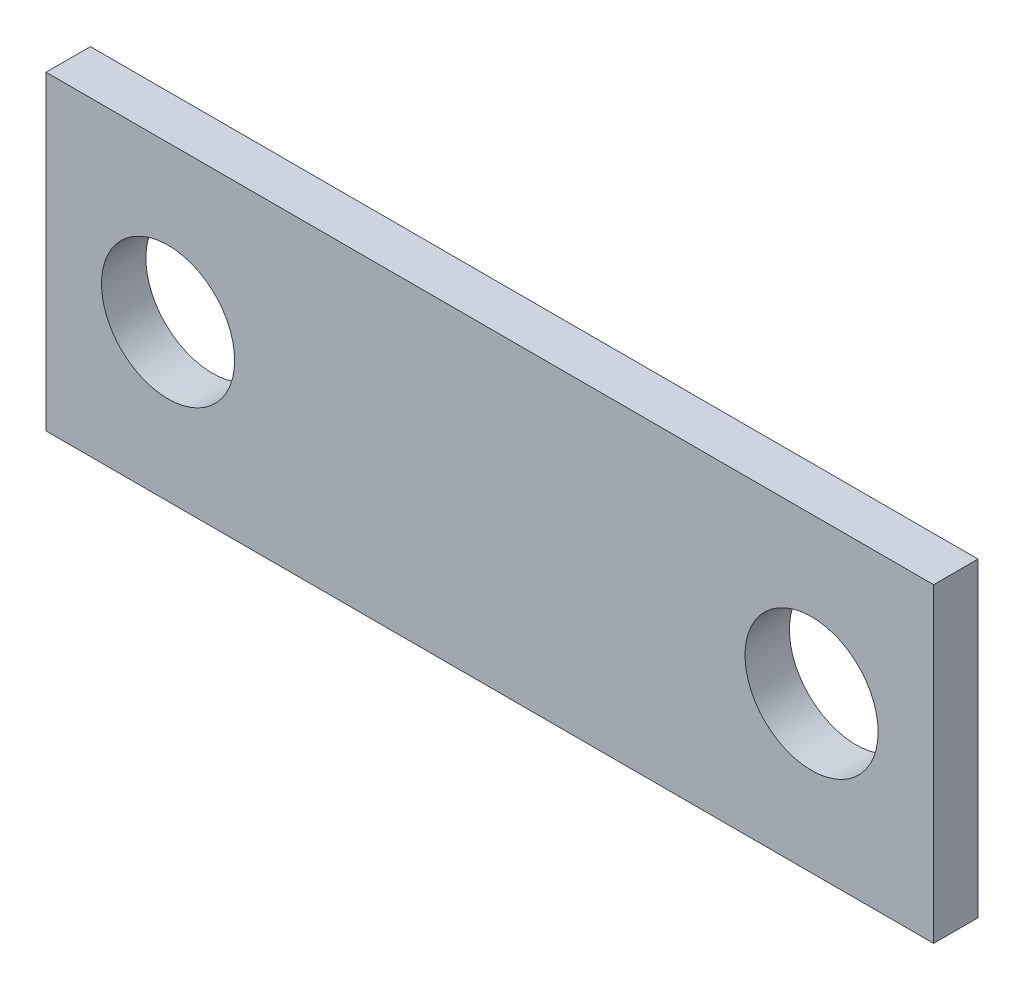
ISO-10303-21;
HEADER;
FILE_DESCRIPTION(('STEP AP214'),'2;1');
FILE_NAME('part.step','',(''),(''),'','','');
FILE_SCHEMA(('AUTOMOTIVE_DESIGN { 1 0 10303 214 1 1 1 1 }'));
ENDSEC;
DATA;
#1=APPLICATION_CONTEXT('core data for automotive mechanical design processes');
#2=APPLICATION_PROTOCOL_DEFINITION('international standard','automotive_design',2000,#1);
#3=PRODUCT_CONTEXT('',#1,'mechanical');
#4=PRODUCT('Part','Part','',(#3));
#5=PRODUCT_RELATED_PRODUCT_CATEGORY('part','',(#4));
#6=PRODUCT_DEFINITION_FORMATION('','',#4);
#7=PRODUCT_DEFINITION_CONTEXT('part definition',#1,'design');
#8=PRODUCT_DEFINITION('design','',#6,#7);
#9=PRODUCT_DEFINITION_SHAPE('','',#8);
#10=(LENGTH_UNIT() NAMED_UNIT(*) SI_UNIT(.MILLI.,.METRE.));
#11=(NAMED_UNIT(*) PLANE_ANGLE_UNIT() SI_UNIT($,.RADIAN.));
#12=(NAMED_UNIT(*) SI_UNIT($,.STERADIAN.) SOLID_ANGLE_UNIT());
#13=UNCERTAINTY_MEASURE_WITH_UNIT(LENGTH_MEASURE(1.E-05),#10,'distance_accuracy_value','');
#14=(GEOMETRIC_REPRESENTATION_CONTEXT(3) GLOBAL_UNCERTAINTY_ASSIGNED_CONTEXT((#13)) GLOBAL_UNIT_ASSIGNED_CONTEXT((#10,
#11,#12)) REPRESENTATION_CONTEXT('',''));
#15=CARTESIAN_POINT('',(0.,0.,0.));
#16=DIRECTION('',(0.,0.,1.));
#17=DIRECTION('',(1.,0.,0.));
#18=AXIS2_PLACEMENT_3D('',#15,#16,#17);
#19=CARTESIAN_POINT('',(-10.,-3.5,1.));
#20=DIRECTION('',(1.,0.,0.));
#21=DIRECTION('',(0.,0.,-1.));
#22=AXIS2_PLACEMENT_3D('',#19,#20,#21);
#23=PLANE('',#22);
#24=DIRECTION('',(0.,-1.,0.));
#25=VECTOR('',#24,1.);
#26=CARTESIAN_POINT('',(-10.,-3.5,0.));
#27=LINE('',#26,#25);
#28=CARTESIAN_POINT('',(-10.,3.5,0.));
#29=VERTEX_POINT('',#28);
#30=CARTESIAN_POINT('',(-10.,-3.5,0.));
#31=VERTEX_POINT('',#30);
#32=EDGE_CURVE('E107',#29,#31,#27,.T.);
#33=ORIENTED_EDGE('',*,*,#32,.T.);
#34=DIRECTION('',(0.,0.,-1.));
#35=VECTOR('',#34,1.);
#36=CARTESIAN_POINT('',(-10.,-3.5,1.));
#37=LINE('',#36,#35);
#38=CARTESIAN_POINT('',(-10.,-3.5,1.));
#39=VERTEX_POINT('',#38);
#40=EDGE_CURVE('E11',#39,#31,#37,.T.);
#41=ORIENTED_EDGE('',*,*,#40,.F.);
#42=DIRECTION('',(0.,-1.,0.));
#43=VECTOR('',#42,1.);
#44=CARTESIAN_POINT('',(-10.,-3.5,1.));
#45=LINE('',#44,#43);
#46=CARTESIAN_POINT('',(-10.,3.5,1.));
#47=VERTEX_POINT('',#46);
#48=EDGE_CURVE('E91',#47,#39,#45,.T.);
#49=ORIENTED_EDGE('',*,*,#48,.F.);
#50=DIRECTION('',(0.,0.,-1.));
#51=VECTOR('',#50,1.);
#52=CARTESIAN_POINT('',(-10.,3.5,1.));
#53=LINE('',#52,#51);
#54=EDGE_CURVE('E103',#47,#29,#53,.T.);
#55=ORIENTED_EDGE('',*,*,#54,.T.);
#56=EDGE_LOOP('',(#33,#41,#49,#55));
#57=FACE_BOUND('',#56,.T.);
#58=ADVANCED_FACE('F39',(#57),#23,.F.);
#59=CARTESIAN_POINT('',(10.,-3.5,1.));
#60=DIRECTION('',(0.,1.,0.));
#61=DIRECTION('',(-1.,0.,0.));
#62=AXIS2_PLACEMENT_3D('',#59,#60,#61);
#63=PLANE('',#62);
#64=DIRECTION('',(1.,0.,0.));
#65=VECTOR('',#64,1.);
#66=CARTESIAN_POINT('',(10.,-3.5,0.));
#67=LINE('',#66,#65);
#68=CARTESIAN_POINT('',(10.,-3.5,0.));
#69=VERTEX_POINT('',#68);
#70=EDGE_CURVE('E96',#31,#69,#67,.T.);
#71=ORIENTED_EDGE('',*,*,#70,.T.);
#72=DIRECTION('',(0.,0.,-1.));
#73=VECTOR('',#72,1.);
#74=CARTESIAN_POINT('',(10.,-3.5,1.));
#75=LINE('',#74,#73);
#76=CARTESIAN_POINT('',(10.,-3.5,1.));
#77=VERTEX_POINT('',#76);
#78=EDGE_CURVE('E48',#77,#69,#75,.T.);
#79=ORIENTED_EDGE('',*,*,#78,.F.);
#80=DIRECTION('',(1.,0.,0.));
#81=VECTOR('',#80,1.);
#82=CARTESIAN_POINT('',(10.,-3.5,1.));
#83=LINE('',#82,#81);
#84=EDGE_CURVE('E86',#39,#77,#83,.T.);
#85=ORIENTED_EDGE('',*,*,#84,.F.);
#86=ORIENTED_EDGE('',*,*,#40,.T.);
#87=EDGE_LOOP('',(#71,#79,#85,#86));
#88=FACE_BOUND('',#87,.T.);
#89=ADVANCED_FACE('F95',(#88),#63,.F.);
#90=CARTESIAN_POINT('',(10.,-3.5,1.));
#91=DIRECTION('',(-1.,0.,0.));
#92=DIRECTION('',(0.,0.,1.));
#93=AXIS2_PLACEMENT_3D('',#90,#91,#92);
#94=PLANE('',#93);
#95=DIRECTION('',(0.,1.,0.));
#96=VECTOR('',#95,1.);
#97=CARTESIAN_POINT('',(10.,-3.5,0.));
#98=LINE('',#97,#96);
#99=CARTESIAN_POINT('',(10.,3.5,0.));
#100=VERTEX_POINT('',#99);
#101=EDGE_CURVE('E73',#69,#100,#98,.T.);
#102=ORIENTED_EDGE('',*,*,#101,.T.);
#103=DIRECTION('',(0.,0.,-1.));
#104=VECTOR('',#103,1.);
#105=CARTESIAN_POINT('',(10.,3.5,1.));
#106=LINE('',#105,#104);
#107=CARTESIAN_POINT('',(10.,3.5,1.));
#108=VERTEX_POINT('',#107);
#109=EDGE_CURVE('E98',#108,#100,#106,.T.);
#110=ORIENTED_EDGE('',*,*,#109,.F.);
#111=DIRECTION('',(0.,1.,0.));
#112=VECTOR('',#111,1.);
#113=CARTESIAN_POINT('',(10.,-3.5,1.));
#114=LINE('',#113,#112);
#115=EDGE_CURVE('E89',#77,#108,#114,.T.);
#116=ORIENTED_EDGE('',*,*,#115,.F.);
#117=ORIENTED_EDGE('',*,*,#78,.T.);
#118=EDGE_LOOP('',(#102,#110,#116,#117));
#119=FACE_BOUND('',#118,.T.);
#120=ADVANCED_FACE('F99',(#119),#94,.F.);
#121=CARTESIAN_POINT('',(10.,3.5,1.));
#122=DIRECTION('',(0.,-1.,0.));
#123=DIRECTION('',(1.,0.,0.));
#124=AXIS2_PLACEMENT_3D('',#121,#122,#123);
#125=PLANE('',#124);
#126=DIRECTION('',(-1.,0.,0.));
#127=VECTOR('',#126,1.);
#128=CARTESIAN_POINT('',(10.,3.5,0.));
#129=LINE('',#128,#127);
#130=EDGE_CURVE('E79',#100,#29,#129,.T.);
#131=ORIENTED_EDGE('',*,*,#130,.T.);
#132=ORIENTED_EDGE('',*,*,#54,.F.);
#133=DIRECTION('',(-1.,0.,0.));
#134=VECTOR('',#133,1.);
#135=CARTESIAN_POINT('',(10.,3.5,1.));
#136=LINE('',#135,#134);
#137=EDGE_CURVE('E56',#108,#47,#136,.T.);
#138=ORIENTED_EDGE('',*,*,#137,.F.);
#139=ORIENTED_EDGE('',*,*,#109,.T.);
#140=EDGE_LOOP('',(#131,#132,#138,#139));
#141=FACE_BOUND('',#140,.T.);
#142=ADVANCED_FACE('F121',(#141),#125,.F.);
#143=CARTESIAN_POINT('',(0.,0.,1.));
#144=DIRECTION('',(0.,0.,1.));
#145=DIRECTION('',(1.,0.,0.));
#146=AXIS2_PLACEMENT_3D('',#143,#144,#145);
#147=PLANE('',#146);
#148=CARTESIAN_POINT('',(-7.25,0.,1.));
#149=DIRECTION('',(0.,0.,1.));
#150=DIRECTION('',(1.,0.,0.));
#151=AXIS2_PLACEMENT_3D('',#148,#149,#150);
#152=CIRCLE('',#151,1.5);
#153=CARTESIAN_POINT('',(-5.75,0.,1.));
#154=VERTEX_POINT('',#153);
#155=EDGE_CURVE('E136',#154,#154,#152,.T.);
#156=ORIENTED_EDGE('',*,*,#155,.F.);
#157=EDGE_LOOP('',(#156));
#158=FACE_BOUND('',#157,.T.);
#159=CARTESIAN_POINT('',(7.25,0.,1.));
#160=DIRECTION('',(0.,0.,1.));
#161=DIRECTION('',(1.,0.,0.));
#162=AXIS2_PLACEMENT_3D('',#159,#160,#161);
#163=CIRCLE('',#162,1.5);
#164=CARTESIAN_POINT('',(8.75,0.,1.));
#165=VERTEX_POINT('',#164);
#166=EDGE_CURVE('E128',#165,#165,#163,.T.);
#167=ORIENTED_EDGE('',*,*,#166,.F.);
#168=EDGE_LOOP('',(#167));
#169=FACE_BOUND('',#168,.T.);
#170=ORIENTED_EDGE('',*,*,#48,.T.);
#171=ORIENTED_EDGE('',*,*,#84,.T.);
#172=ORIENTED_EDGE('',*,*,#115,.T.);
#173=ORIENTED_EDGE('',*,*,#137,.T.);
#174=EDGE_LOOP('',(#170,#171,#172,#173));
#175=FACE_BOUND('',#174,.T.);
#176=ADVANCED_FACE('F87',(#158,#169,#175),#147,.T.);
#177=CARTESIAN_POINT('',(0.,0.,0.));
#178=DIRECTION('',(0.,0.,1.));
#179=DIRECTION('',(1.,0.,0.));
#180=AXIS2_PLACEMENT_3D('',#177,#178,#179);
#181=PLANE('',#180);
#182=CARTESIAN_POINT('',(-7.25,0.,0.));
#183=DIRECTION('',(0.,0.,1.));
#184=DIRECTION('',(1.,0.,0.));
#185=AXIS2_PLACEMENT_3D('',#182,#183,#184);
#186=CIRCLE('',#185,1.5);
#187=CARTESIAN_POINT('',(-5.75,0.,0.));
#188=VERTEX_POINT('',#187);
#189=EDGE_CURVE('E111',#188,#188,#186,.T.);
#190=ORIENTED_EDGE('',*,*,#189,.T.);
#191=EDGE_LOOP('',(#190));
#192=FACE_BOUND('',#191,.T.);
#193=CARTESIAN_POINT('',(7.25,0.,0.));
#194=DIRECTION('',(0.,0.,1.));
#195=DIRECTION('',(1.,0.,0.));
#196=AXIS2_PLACEMENT_3D('',#193,#194,#195);
#197=CIRCLE('',#196,1.5);
#198=CARTESIAN_POINT('',(8.75,0.,0.));
#199=VERTEX_POINT('',#198);
#200=EDGE_CURVE('E132',#199,#199,#197,.T.);
#201=ORIENTED_EDGE('',*,*,#200,.T.);
#202=EDGE_LOOP('',(#201));
#203=FACE_BOUND('',#202,.T.);
#204=ORIENTED_EDGE('',*,*,#32,.F.);
#205=ORIENTED_EDGE('',*,*,#130,.F.);
#206=ORIENTED_EDGE('',*,*,#101,.F.);
#207=ORIENTED_EDGE('',*,*,#70,.F.);
#208=EDGE_LOOP('',(#204,#205,#206,#207));
#209=FACE_BOUND('',#208,.T.);
#210=ADVANCED_FACE('F124',(#192,#203,#209),#181,.F.);
#211=CARTESIAN_POINT('',(7.25,0.,0.));
#212=DIRECTION('',(0.,0.,1.));
#213=DIRECTION('',(1.,0.,0.));
#214=AXIS2_PLACEMENT_3D('',#211,#212,#213);
#215=CYLINDRICAL_SURFACE('',#214,1.5);
#216=ORIENTED_EDGE('',*,*,#200,.F.);
#217=EDGE_LOOP('',(#216));
#218=FACE_BOUND('',#217,.T.);
#219=ORIENTED_EDGE('',*,*,#166,.T.);
#220=EDGE_LOOP('',(#219));
#221=FACE_BOUND('',#220,.T.);
#222=ADVANCED_FACE('F149',(#218,#221),#215,.F.);
#223=CARTESIAN_POINT('',(-7.25,0.,0.));
#224=DIRECTION('',(0.,0.,1.));
#225=DIRECTION('',(1.,0.,0.));
#226=AXIS2_PLACEMENT_3D('',#223,#224,#225);
#227=CYLINDRICAL_SURFACE('',#226,1.5);
#228=ORIENTED_EDGE('',*,*,#189,.F.);
#229=EDGE_LOOP('',(#228));
#230=FACE_BOUND('',#229,.T.);
#231=ORIENTED_EDGE('',*,*,#155,.T.);
#232=EDGE_LOOP('',(#231));
#233=FACE_BOUND('',#232,.T.);
#234=ADVANCED_FACE('F146',(#230,#233),#227,.F.);
#235=CLOSED_SHELL('',(#58,#89,#120,#142,#176,#210,#222,#234));
#236=MANIFOLD_SOLID_BREP('B2',#235);
#237=ADVANCED_BREP_SHAPE_REPRESENTATION('',(#18,#236),#14);
#238=SHAPE_DEFINITION_REPRESENTATION(#9,#237);
ENDSEC;
END-ISO-10303-21;
